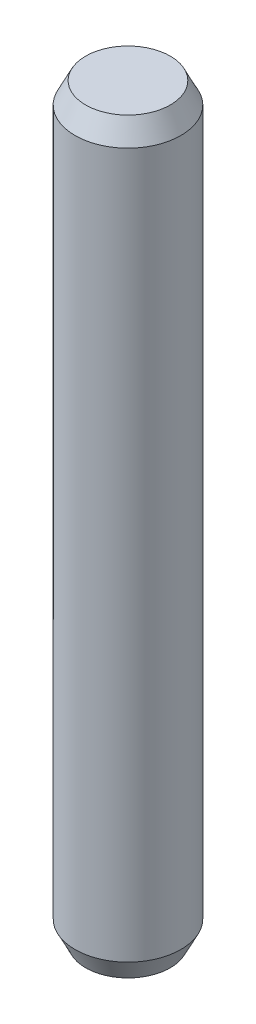
ISO-10303-21;
HEADER;
FILE_DESCRIPTION(('STEP AP214'),'2;1');
FILE_NAME('part.step','',(''),(''),'','','');
FILE_SCHEMA(('AUTOMOTIVE_DESIGN { 1 0 10303 214 1 1 1 1 }'));
ENDSEC;
DATA;
#1=APPLICATION_CONTEXT('core data for automotive mechanical design processes');
#2=APPLICATION_PROTOCOL_DEFINITION('international standard','automotive_design',2000,#1);
#3=PRODUCT_CONTEXT('',#1,'mechanical');
#4=PRODUCT('Part','Part','',(#3));
#5=PRODUCT_RELATED_PRODUCT_CATEGORY('part','',(#4));
#6=PRODUCT_DEFINITION_FORMATION('','',#4);
#7=PRODUCT_DEFINITION_CONTEXT('part definition',#1,'design');
#8=PRODUCT_DEFINITION('design','',#6,#7);
#9=PRODUCT_DEFINITION_SHAPE('','',#8);
#10=(LENGTH_UNIT() NAMED_UNIT(*) SI_UNIT(.MILLI.,.METRE.));
#11=(NAMED_UNIT(*) PLANE_ANGLE_UNIT() SI_UNIT($,.RADIAN.));
#12=(NAMED_UNIT(*) SI_UNIT($,.STERADIAN.) SOLID_ANGLE_UNIT());
#13=UNCERTAINTY_MEASURE_WITH_UNIT(LENGTH_MEASURE(1.E-05),#10,'distance_accuracy_value','');
#14=(GEOMETRIC_REPRESENTATION_CONTEXT(3) GLOBAL_UNCERTAINTY_ASSIGNED_CONTEXT((#13)) GLOBAL_UNIT_ASSIGNED_CONTEXT((#10,
#11,#12)) REPRESENTATION_CONTEXT('',''));
#15=CARTESIAN_POINT('',(0.,0.,0.));
#16=DIRECTION('',(0.,0.,1.));
#17=DIRECTION('',(1.,0.,0.));
#18=AXIS2_PLACEMENT_3D('',#15,#16,#17);
#19=CARTESIAN_POINT('',(21.,35.3,-21.));
#20=DIRECTION('',(0.,1.,0.));
#21=DIRECTION('',(1.,0.,0.));
#22=AXIS2_PLACEMENT_3D('',#19,#20,#21);
#23=PLANE('',#22);
#24=CARTESIAN_POINT('',(21.,35.3,-21.));
#25=DIRECTION('',(0.,-1.,0.));
#26=DIRECTION('',(1.,0.,0.));
#27=AXIS2_PLACEMENT_3D('',#24,#25,#26);
#28=CIRCLE('',#27,2.);
#29=CARTESIAN_POINT('',(19.,35.3,-21.));
#30=VERTEX_POINT('',#29);
#31=EDGE_CURVE('E27',#30,#30,#28,.T.);
#32=ORIENTED_EDGE('',*,*,#31,.F.);
#33=EDGE_LOOP('',(#32));
#34=FACE_BOUND('',#33,.T.);
#35=ADVANCED_FACE('F17',(#34),#23,.T.);
#36=CARTESIAN_POINT('',(21.,34.8,-21.));
#37=DIRECTION('',(0.,-1.,0.));
#38=DIRECTION('',(1.,0.,0.));
#39=AXIS2_PLACEMENT_3D('',#36,#37,#38);
#40=CONICAL_SURFACE('',#39,2.25,0.463647609000804);
#41=ORIENTED_EDGE('',*,*,#31,.T.);
#42=DIRECTION('',(-0.447213595499956,-0.894427190999917,0.));
#43=VECTOR('',#42,1.);
#44=CARTESIAN_POINT('',(18.75,34.8,-21.));
#45=LINE('',#44,#43);
#46=CARTESIAN_POINT('',(18.5,34.3,-21.));
#47=VERTEX_POINT('',#46);
#48=EDGE_CURVE('E11',#30,#47,#45,.T.);
#49=ORIENTED_EDGE('',*,*,#48,.T.);
#50=CARTESIAN_POINT('',(21.,34.3,-21.));
#51=DIRECTION('',(0.,1.,0.));
#52=DIRECTION('',(1.,0.,0.));
#53=AXIS2_PLACEMENT_3D('',#50,#51,#52);
#54=CIRCLE('',#53,2.5);
#55=EDGE_CURVE('E21',#47,#47,#54,.T.);
#56=ORIENTED_EDGE('',*,*,#55,.T.);
#57=ORIENTED_EDGE('',*,*,#48,.F.);
#58=EDGE_LOOP('',(#41,#49,#56,#57));
#59=FACE_BOUND('',#58,.T.);
#60=ADVANCED_FACE('F19',(#59),#40,.T.);
#61=CARTESIAN_POINT('',(21.,0.,-21.));
#62=DIRECTION('',(0.,1.,0.));
#63=DIRECTION('',(1.,0.,0.));
#64=AXIS2_PLACEMENT_3D('',#61,#62,#63);
#65=PLANE('',#64);
#66=CARTESIAN_POINT('',(21.,0.,-21.));
#67=DIRECTION('',(0.,1.,0.));
#68=DIRECTION('',(1.,0.,0.));
#69=AXIS2_PLACEMENT_3D('',#66,#67,#68);
#70=CIRCLE('',#69,2.);
#71=CARTESIAN_POINT('',(19.,0.,-21.));
#72=VERTEX_POINT('',#71);
#73=EDGE_CURVE('E65',#72,#72,#70,.T.);
#74=ORIENTED_EDGE('',*,*,#73,.F.);
#75=EDGE_LOOP('',(#74));
#76=FACE_BOUND('',#75,.T.);
#77=ADVANCED_FACE('F87',(#76),#65,.F.);
#78=CARTESIAN_POINT('',(21.,0.,-21.));
#79=DIRECTION('',(0.,1.,0.));
#80=DIRECTION('',(1.,0.,0.));
#81=AXIS2_PLACEMENT_3D('',#78,#79,#80);
#82=CYLINDRICAL_SURFACE('',#81,2.5);
#83=ORIENTED_EDGE('',*,*,#55,.F.);
#84=DIRECTION('',(0.,-1.,0.));
#85=VECTOR('',#84,1.);
#86=CARTESIAN_POINT('',(18.5,0.,-21.));
#87=LINE('',#86,#85);
#88=CARTESIAN_POINT('',(18.5,1.,-21.));
#89=VERTEX_POINT('',#88);
#90=EDGE_CURVE('E53',#47,#89,#87,.T.);
#91=ORIENTED_EDGE('',*,*,#90,.T.);
#92=CARTESIAN_POINT('',(21.,1.,-21.));
#93=DIRECTION('',(0.,-1.,0.));
#94=DIRECTION('',(1.,0.,0.));
#95=AXIS2_PLACEMENT_3D('',#92,#93,#94);
#96=CIRCLE('',#95,2.5);
#97=EDGE_CURVE('E57',#89,#89,#96,.T.);
#98=ORIENTED_EDGE('',*,*,#97,.F.);
#99=ORIENTED_EDGE('',*,*,#90,.F.);
#100=EDGE_LOOP('',(#83,#91,#98,#99));
#101=FACE_BOUND('',#100,.T.);
#102=ADVANCED_FACE('F55',(#101),#82,.T.);
#103=CARTESIAN_POINT('',(21.,0.5,-21.));
#104=DIRECTION('',(0.,1.,0.));
#105=DIRECTION('',(1.,0.,0.));
#106=AXIS2_PLACEMENT_3D('',#103,#104,#105);
#107=CONICAL_SURFACE('',#106,2.25,0.463647609000805);
#108=ORIENTED_EDGE('',*,*,#97,.T.);
#109=DIRECTION('',(0.447213595499957,-0.894427190999916,0.));
#110=VECTOR('',#109,1.);
#111=CARTESIAN_POINT('',(18.75,0.5,-21.));
#112=LINE('',#111,#110);
#113=EDGE_CURVE('E62',#89,#72,#112,.T.);
#114=ORIENTED_EDGE('',*,*,#113,.T.);
#115=ORIENTED_EDGE('',*,*,#73,.T.);
#116=ORIENTED_EDGE('',*,*,#113,.F.);
#117=EDGE_LOOP('',(#108,#114,#115,#116));
#118=FACE_BOUND('',#117,.T.);
#119=ADVANCED_FACE('F63',(#118),#107,.T.);
#120=CLOSED_SHELL('',(#35,#60,#77,#102,#119));
#121=MANIFOLD_SOLID_BREP('B1',#120);
#122=ADVANCED_BREP_SHAPE_REPRESENTATION('',(#18,#121),#14);
#123=SHAPE_DEFINITION_REPRESENTATION(#9,#122);
ENDSEC;
END-ISO-10303-21;
